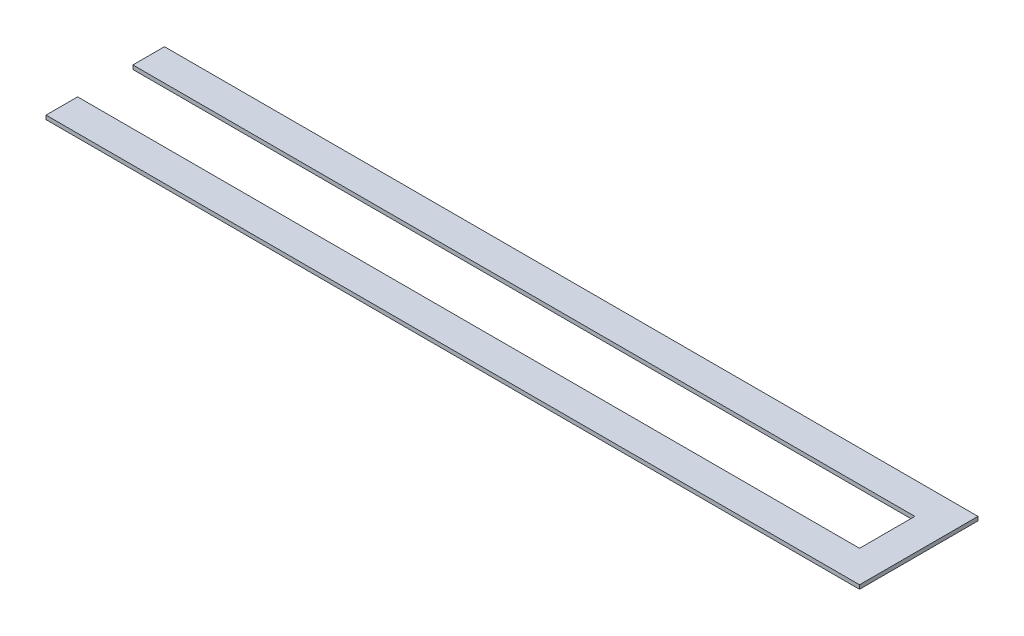
ISO-10303-21;
HEADER;
FILE_DESCRIPTION(('STEP AP214'),'2;1');
FILE_NAME('part.step','',(''),(''),'','','');
FILE_SCHEMA(('AUTOMOTIVE_DESIGN { 1 0 10303 214 1 1 1 1 }'));
ENDSEC;
DATA;
#1=APPLICATION_CONTEXT('core data for automotive mechanical design processes');
#2=APPLICATION_PROTOCOL_DEFINITION('international standard','automotive_design',2000,#1);
#3=PRODUCT_CONTEXT('',#1,'mechanical');
#4=PRODUCT('Part','Part','',(#3));
#5=PRODUCT_RELATED_PRODUCT_CATEGORY('part','',(#4));
#6=PRODUCT_DEFINITION_FORMATION('','',#4);
#7=PRODUCT_DEFINITION_CONTEXT('part definition',#1,'design');
#8=PRODUCT_DEFINITION('design','',#6,#7);
#9=PRODUCT_DEFINITION_SHAPE('','',#8);
#10=(LENGTH_UNIT() NAMED_UNIT(*) SI_UNIT(.MILLI.,.METRE.));
#11=(NAMED_UNIT(*) PLANE_ANGLE_UNIT() SI_UNIT($,.RADIAN.));
#12=(NAMED_UNIT(*) SI_UNIT($,.STERADIAN.) SOLID_ANGLE_UNIT());
#13=UNCERTAINTY_MEASURE_WITH_UNIT(LENGTH_MEASURE(1.E-05),#10,'distance_accuracy_value','');
#14=(GEOMETRIC_REPRESENTATION_CONTEXT(3) GLOBAL_UNCERTAINTY_ASSIGNED_CONTEXT((#13)) GLOBAL_UNIT_ASSIGNED_CONTEXT((#10,
#11,#12)) REPRESENTATION_CONTEXT('',''));
#15=CARTESIAN_POINT('',(0.,0.,0.));
#16=DIRECTION('',(0.,0.,1.));
#17=DIRECTION('',(1.,0.,0.));
#18=AXIS2_PLACEMENT_3D('',#15,#16,#17);
#19=CARTESIAN_POINT('',(0.,1.,-7.99999999999997));
#20=DIRECTION('',(0.,0.,-1.));
#21=DIRECTION('',(-1.,0.,0.));
#22=AXIS2_PLACEMENT_3D('',#19,#20,#21);
#23=PLANE('',#22);
#24=DIRECTION('',(1.,0.,0.));
#25=VECTOR('',#24,1.);
#26=CARTESIAN_POINT('',(0.,0.,-7.99999999999997));
#27=LINE('',#26,#25);
#28=CARTESIAN_POINT('',(-206.,0.,-7.99999999999997));
#29=VERTEX_POINT('',#28);
#30=CARTESIAN_POINT('',(-8.,0.,-7.99999999999997));
#31=VERTEX_POINT('',#30);
#32=EDGE_CURVE('E142',#29,#31,#27,.T.);
#33=ORIENTED_EDGE('',*,*,#32,.F.);
#34=DIRECTION('',(0.,-1.,0.));
#35=VECTOR('',#34,1.);
#36=CARTESIAN_POINT('',(-206.,1.,-7.99999999999997));
#37=LINE('',#36,#35);
#38=CARTESIAN_POINT('',(-206.,1.,-7.99999999999997));
#39=VERTEX_POINT('',#38);
#40=EDGE_CURVE('E11',#39,#29,#37,.T.);
#41=ORIENTED_EDGE('',*,*,#40,.F.);
#42=DIRECTION('',(1.,0.,0.));
#43=VECTOR('',#42,1.);
#44=CARTESIAN_POINT('',(0.,1.,-7.99999999999997));
#45=LINE('',#44,#43);
#46=CARTESIAN_POINT('',(-8.,1.,-7.99999999999997));
#47=VERTEX_POINT('',#46);
#48=EDGE_CURVE('E168',#39,#47,#45,.T.);
#49=ORIENTED_EDGE('',*,*,#48,.T.);
#50=DIRECTION('',(0.,-1.,0.));
#51=VECTOR('',#50,1.);
#52=CARTESIAN_POINT('',(-8.,1.,-7.99999999999997));
#53=LINE('',#52,#51);
#54=EDGE_CURVE('E94',#47,#31,#53,.T.);
#55=ORIENTED_EDGE('',*,*,#54,.T.);
#56=EDGE_LOOP('',(#33,#41,#49,#55));
#57=FACE_BOUND('',#56,.T.);
#58=ADVANCED_FACE('F43',(#57),#23,.T.);
#59=CARTESIAN_POINT('',(-206.,1.,0.));
#60=DIRECTION('',(-1.,0.,0.));
#61=DIRECTION('',(0.,0.,1.));
#62=AXIS2_PLACEMENT_3D('',#59,#60,#61);
#63=PLANE('',#62);
#64=DIRECTION('',(0.,0.,-1.));
#65=VECTOR('',#64,1.);
#66=CARTESIAN_POINT('',(-206.,0.,0.));
#67=LINE('',#66,#65);
#68=CARTESIAN_POINT('',(-206.,0.,0.));
#69=VERTEX_POINT('',#68);
#70=EDGE_CURVE('E146',#69,#29,#67,.T.);
#71=ORIENTED_EDGE('',*,*,#70,.F.);
#72=DIRECTION('',(0.,-1.,0.));
#73=VECTOR('',#72,1.);
#74=CARTESIAN_POINT('',(-206.,1.,0.));
#75=LINE('',#74,#73);
#76=CARTESIAN_POINT('',(-206.,1.,0.));
#77=VERTEX_POINT('',#76);
#78=EDGE_CURVE('E52',#77,#69,#75,.T.);
#79=ORIENTED_EDGE('',*,*,#78,.F.);
#80=DIRECTION('',(0.,0.,-1.));
#81=VECTOR('',#80,1.);
#82=CARTESIAN_POINT('',(-206.,1.,0.));
#83=LINE('',#82,#81);
#84=EDGE_CURVE('E207',#77,#39,#83,.T.);
#85=ORIENTED_EDGE('',*,*,#84,.T.);
#86=ORIENTED_EDGE('',*,*,#40,.T.);
#87=EDGE_LOOP('',(#71,#79,#85,#86));
#88=FACE_BOUND('',#87,.T.);
#89=ADVANCED_FACE('F192',(#88),#63,.T.);
#90=CARTESIAN_POINT('',(0.,1.,0.));
#91=DIRECTION('',(0.,0.,1.));
#92=DIRECTION('',(1.,0.,0.));
#93=AXIS2_PLACEMENT_3D('',#90,#91,#92);
#94=PLANE('',#93);
#95=DIRECTION('',(-1.,0.,0.));
#96=VECTOR('',#95,1.);
#97=CARTESIAN_POINT('',(0.,0.,0.));
#98=LINE('',#97,#96);
#99=CARTESIAN_POINT('',(0.,0.,0.));
#100=VERTEX_POINT('',#99);
#101=EDGE_CURVE('E150',#100,#69,#98,.T.);
#102=ORIENTED_EDGE('',*,*,#101,.F.);
#103=DIRECTION('',(0.,-1.,0.));
#104=VECTOR('',#103,1.);
#105=CARTESIAN_POINT('',(0.,1.,0.));
#106=LINE('',#105,#104);
#107=CARTESIAN_POINT('',(0.,1.,0.));
#108=VERTEX_POINT('',#107);
#109=EDGE_CURVE('E179',#108,#100,#106,.T.);
#110=ORIENTED_EDGE('',*,*,#109,.F.);
#111=DIRECTION('',(-1.,0.,0.));
#112=VECTOR('',#111,1.);
#113=CARTESIAN_POINT('',(0.,1.,0.));
#114=LINE('',#113,#112);
#115=EDGE_CURVE('E188',#108,#77,#114,.T.);
#116=ORIENTED_EDGE('',*,*,#115,.T.);
#117=ORIENTED_EDGE('',*,*,#78,.T.);
#118=EDGE_LOOP('',(#102,#110,#116,#117));
#119=FACE_BOUND('',#118,.T.);
#120=ADVANCED_FACE('F186',(#119),#94,.T.);
#121=CARTESIAN_POINT('',(0.,1.,0.));
#122=DIRECTION('',(-1.,0.,0.));
#123=DIRECTION('',(0.,0.,1.));
#124=AXIS2_PLACEMENT_3D('',#121,#122,#123);
#125=PLANE('',#124);
#126=DIRECTION('',(0.,0.,-1.));
#127=VECTOR('',#126,1.);
#128=CARTESIAN_POINT('',(0.,0.,0.));
#129=LINE('',#128,#127);
#130=CARTESIAN_POINT('',(0.,0.,-30.));
#131=VERTEX_POINT('',#130);
#132=EDGE_CURVE('E154',#100,#131,#129,.T.);
#133=ORIENTED_EDGE('',*,*,#132,.T.);
#134=DIRECTION('',(0.,-1.,0.));
#135=VECTOR('',#134,1.);
#136=CARTESIAN_POINT('',(0.,1.,-30.));
#137=LINE('',#136,#135);
#138=CARTESIAN_POINT('',(0.,1.,-30.));
#139=VERTEX_POINT('',#138);
#140=EDGE_CURVE('E175',#139,#131,#137,.T.);
#141=ORIENTED_EDGE('',*,*,#140,.F.);
#142=DIRECTION('',(0.,0.,-1.));
#143=VECTOR('',#142,1.);
#144=CARTESIAN_POINT('',(0.,1.,0.));
#145=LINE('',#144,#143);
#146=EDGE_CURVE('E136',#108,#139,#145,.T.);
#147=ORIENTED_EDGE('',*,*,#146,.F.);
#148=ORIENTED_EDGE('',*,*,#109,.T.);
#149=EDGE_LOOP('',(#133,#141,#147,#148));
#150=FACE_BOUND('',#149,.T.);
#151=ADVANCED_FACE('F199',(#150),#125,.F.);
#152=CARTESIAN_POINT('',(0.,1.,-30.));
#153=DIRECTION('',(0.,0.,1.));
#154=DIRECTION('',(1.,0.,0.));
#155=AXIS2_PLACEMENT_3D('',#152,#153,#154);
#156=PLANE('',#155);
#157=DIRECTION('',(-1.,0.,0.));
#158=VECTOR('',#157,1.);
#159=CARTESIAN_POINT('',(0.,0.,-30.));
#160=LINE('',#159,#158);
#161=CARTESIAN_POINT('',(-206.,0.,-30.));
#162=VERTEX_POINT('',#161);
#163=EDGE_CURVE('E157',#131,#162,#160,.T.);
#164=ORIENTED_EDGE('',*,*,#163,.T.);
#165=DIRECTION('',(0.,-1.,0.));
#166=VECTOR('',#165,1.);
#167=CARTESIAN_POINT('',(-206.,1.,-30.));
#168=LINE('',#167,#166);
#169=CARTESIAN_POINT('',(-206.,1.,-30.));
#170=VERTEX_POINT('',#169);
#171=EDGE_CURVE('E122',#170,#162,#168,.T.);
#172=ORIENTED_EDGE('',*,*,#171,.F.);
#173=DIRECTION('',(-1.,0.,0.));
#174=VECTOR('',#173,1.);
#175=CARTESIAN_POINT('',(0.,1.,-30.));
#176=LINE('',#175,#174);
#177=EDGE_CURVE('E131',#139,#170,#176,.T.);
#178=ORIENTED_EDGE('',*,*,#177,.F.);
#179=ORIENTED_EDGE('',*,*,#140,.T.);
#180=EDGE_LOOP('',(#164,#172,#178,#179));
#181=FACE_BOUND('',#180,.T.);
#182=ADVANCED_FACE('F202',(#181),#156,.F.);
#183=CARTESIAN_POINT('',(-206.,1.,0.));
#184=DIRECTION('',(-1.,0.,0.));
#185=DIRECTION('',(0.,0.,1.));
#186=AXIS2_PLACEMENT_3D('',#183,#184,#185);
#187=PLANE('',#186);
#188=DIRECTION('',(0.,0.,-1.));
#189=VECTOR('',#188,1.);
#190=CARTESIAN_POINT('',(-206.,0.,0.));
#191=LINE('',#190,#189);
#192=CARTESIAN_POINT('',(-206.,0.,-22.));
#193=VERTEX_POINT('',#192);
#194=EDGE_CURVE('E120',#193,#162,#191,.T.);
#195=ORIENTED_EDGE('',*,*,#194,.F.);
#196=DIRECTION('',(0.,-1.,0.));
#197=VECTOR('',#196,1.);
#198=CARTESIAN_POINT('',(-206.,1.,-22.));
#199=LINE('',#198,#197);
#200=CARTESIAN_POINT('',(-206.,1.,-22.));
#201=VERTEX_POINT('',#200);
#202=EDGE_CURVE('E114',#201,#193,#199,.T.);
#203=ORIENTED_EDGE('',*,*,#202,.F.);
#204=DIRECTION('',(0.,0.,-1.));
#205=VECTOR('',#204,1.);
#206=CARTESIAN_POINT('',(-206.,1.,0.));
#207=LINE('',#206,#205);
#208=EDGE_CURVE('E118',#201,#170,#207,.T.);
#209=ORIENTED_EDGE('',*,*,#208,.T.);
#210=ORIENTED_EDGE('',*,*,#171,.T.);
#211=EDGE_LOOP('',(#195,#203,#209,#210));
#212=FACE_BOUND('',#211,.T.);
#213=ADVANCED_FACE('F116',(#212),#187,.T.);
#214=CARTESIAN_POINT('',(0.,1.,-22.));
#215=DIRECTION('',(0.,0.,-1.));
#216=DIRECTION('',(-1.,0.,0.));
#217=AXIS2_PLACEMENT_3D('',#214,#215,#216);
#218=PLANE('',#217);
#219=DIRECTION('',(1.,0.,0.));
#220=VECTOR('',#219,1.);
#221=CARTESIAN_POINT('',(0.,0.,-22.));
#222=LINE('',#221,#220);
#223=CARTESIAN_POINT('',(-8.,0.,-22.));
#224=VERTEX_POINT('',#223);
#225=EDGE_CURVE('E87',#193,#224,#222,.T.);
#226=ORIENTED_EDGE('',*,*,#225,.T.);
#227=DIRECTION('',(0.,-1.,0.));
#228=VECTOR('',#227,1.);
#229=CARTESIAN_POINT('',(-8.,1.,-22.));
#230=LINE('',#229,#228);
#231=CARTESIAN_POINT('',(-8.,1.,-22.));
#232=VERTEX_POINT('',#231);
#233=EDGE_CURVE('E123',#232,#224,#230,.T.);
#234=ORIENTED_EDGE('',*,*,#233,.F.);
#235=DIRECTION('',(1.,0.,0.));
#236=VECTOR('',#235,1.);
#237=CARTESIAN_POINT('',(0.,1.,-22.));
#238=LINE('',#237,#236);
#239=EDGE_CURVE('E125',#201,#232,#238,.T.);
#240=ORIENTED_EDGE('',*,*,#239,.F.);
#241=ORIENTED_EDGE('',*,*,#202,.T.);
#242=EDGE_LOOP('',(#226,#234,#240,#241));
#243=FACE_BOUND('',#242,.T.);
#244=ADVANCED_FACE('F126',(#243),#218,.F.);
#245=CARTESIAN_POINT('',(-7.99999999999999,1.,0.));
#246=DIRECTION('',(1.,0.,0.));
#247=DIRECTION('',(0.,0.,-1.));
#248=AXIS2_PLACEMENT_3D('',#245,#246,#247);
#249=PLANE('',#248);
#250=DIRECTION('',(0.,0.,1.));
#251=VECTOR('',#250,1.);
#252=CARTESIAN_POINT('',(-7.99999999999999,0.,0.));
#253=LINE('',#252,#251);
#254=EDGE_CURVE('E165',#224,#31,#253,.T.);
#255=ORIENTED_EDGE('',*,*,#254,.T.);
#256=ORIENTED_EDGE('',*,*,#54,.F.);
#257=DIRECTION('',(0.,0.,1.));
#258=VECTOR('',#257,1.);
#259=CARTESIAN_POINT('',(-7.99999999999999,1.,0.));
#260=LINE('',#259,#258);
#261=EDGE_CURVE('E60',#232,#47,#260,.T.);
#262=ORIENTED_EDGE('',*,*,#261,.F.);
#263=ORIENTED_EDGE('',*,*,#233,.T.);
#264=EDGE_LOOP('',(#255,#256,#262,#263));
#265=FACE_BOUND('',#264,.T.);
#266=ADVANCED_FACE('F205',(#265),#249,.F.);
#267=CARTESIAN_POINT('',(0.,1.,0.));
#268=DIRECTION('',(0.,1.,0.));
#269=DIRECTION('',(0.,0.,1.));
#270=AXIS2_PLACEMENT_3D('',#267,#268,#269);
#271=PLANE('',#270);
#272=ORIENTED_EDGE('',*,*,#48,.F.);
#273=ORIENTED_EDGE('',*,*,#84,.F.);
#274=ORIENTED_EDGE('',*,*,#115,.F.);
#275=ORIENTED_EDGE('',*,*,#146,.T.);
#276=ORIENTED_EDGE('',*,*,#177,.T.);
#277=ORIENTED_EDGE('',*,*,#208,.F.);
#278=ORIENTED_EDGE('',*,*,#239,.T.);
#279=ORIENTED_EDGE('',*,*,#261,.T.);
#280=EDGE_LOOP('',(#272,#273,#274,#275,#276,#277,#278,#279));
#281=FACE_BOUND('',#280,.T.);
#282=ADVANCED_FACE('F129',(#281),#271,.T.);
#283=CARTESIAN_POINT('',(0.,0.,0.));
#284=DIRECTION('',(0.,1.,0.));
#285=DIRECTION('',(0.,0.,1.));
#286=AXIS2_PLACEMENT_3D('',#283,#284,#285);
#287=PLANE('',#286);
#288=ORIENTED_EDGE('',*,*,#32,.T.);
#289=ORIENTED_EDGE('',*,*,#254,.F.);
#290=ORIENTED_EDGE('',*,*,#225,.F.);
#291=ORIENTED_EDGE('',*,*,#194,.T.);
#292=ORIENTED_EDGE('',*,*,#163,.F.);
#293=ORIENTED_EDGE('',*,*,#132,.F.);
#294=ORIENTED_EDGE('',*,*,#101,.T.);
#295=ORIENTED_EDGE('',*,*,#70,.T.);
#296=EDGE_LOOP('',(#288,#289,#290,#291,#292,#293,#294,#295));
#297=FACE_BOUND('',#296,.T.);
#298=ADVANCED_FACE('F195',(#297),#287,.F.);
#299=CLOSED_SHELL('',(#58,#89,#120,#151,#182,#213,#244,#266,#282,#298));
#300=MANIFOLD_SOLID_BREP('B2',#299);
#301=ADVANCED_BREP_SHAPE_REPRESENTATION('',(#18,#300),#14);
#302=SHAPE_DEFINITION_REPRESENTATION(#9,#301);
ENDSEC;
END-ISO-10303-21;
